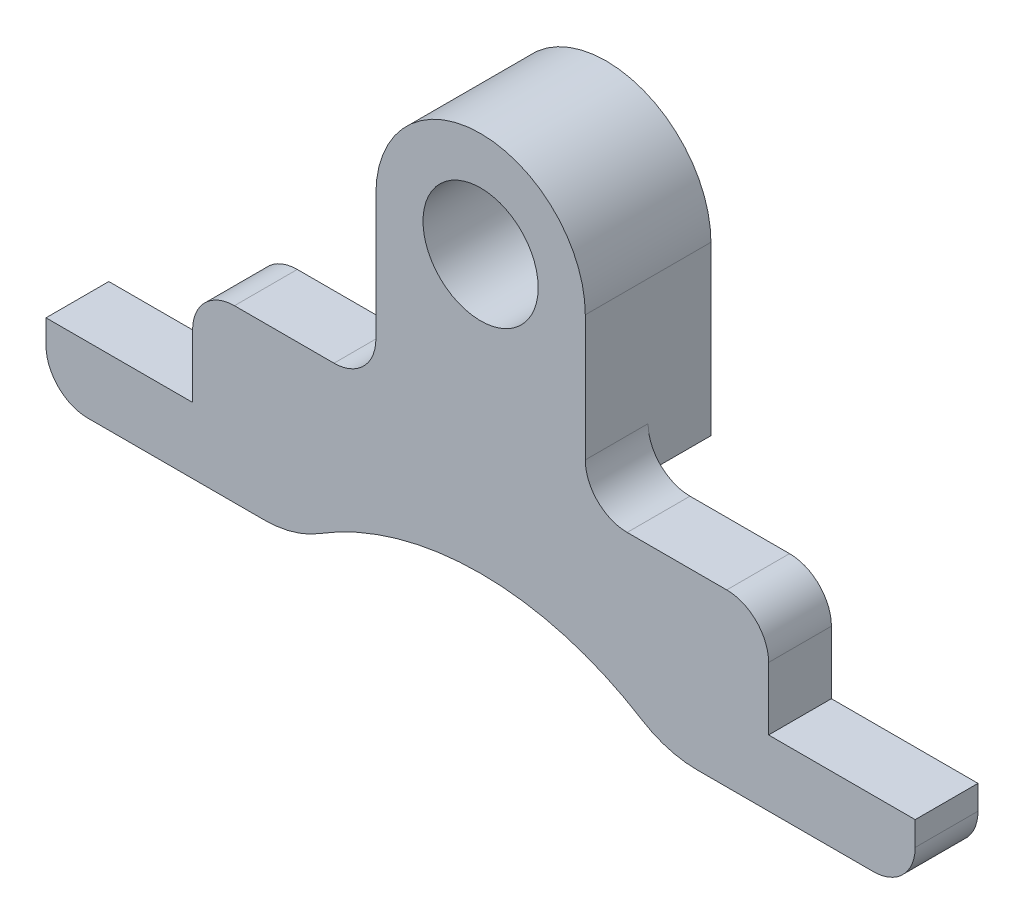
ISO-10303-21;
HEADER;
FILE_DESCRIPTION(('STEP AP214'),'2;1');
FILE_NAME('part.step','',(''),(''),'','','');
FILE_SCHEMA(('AUTOMOTIVE_DESIGN { 1 0 10303 214 1 1 1 1 }'));
ENDSEC;
DATA;
#1=APPLICATION_CONTEXT('core data for automotive mechanical design processes');
#2=APPLICATION_PROTOCOL_DEFINITION('international standard','automotive_design',2000,#1);
#3=PRODUCT_CONTEXT('',#1,'mechanical');
#4=PRODUCT('Part','Part','',(#3));
#5=PRODUCT_RELATED_PRODUCT_CATEGORY('part','',(#4));
#6=PRODUCT_DEFINITION_FORMATION('','',#4);
#7=PRODUCT_DEFINITION_CONTEXT('part definition',#1,'design');
#8=PRODUCT_DEFINITION('design','',#6,#7);
#9=PRODUCT_DEFINITION_SHAPE('','',#8);
#10=(LENGTH_UNIT() NAMED_UNIT(*) SI_UNIT(.MILLI.,.METRE.));
#11=(NAMED_UNIT(*) PLANE_ANGLE_UNIT() SI_UNIT($,.RADIAN.));
#12=(NAMED_UNIT(*) SI_UNIT($,.STERADIAN.) SOLID_ANGLE_UNIT());
#13=UNCERTAINTY_MEASURE_WITH_UNIT(LENGTH_MEASURE(1.E-05),#10,'distance_accuracy_value','');
#14=(GEOMETRIC_REPRESENTATION_CONTEXT(3) GLOBAL_UNCERTAINTY_ASSIGNED_CONTEXT((#13)) GLOBAL_UNIT_ASSIGNED_CONTEXT((#10,
#11,#12)) REPRESENTATION_CONTEXT('',''));
#15=CARTESIAN_POINT('',(0.,0.,0.));
#16=DIRECTION('',(0.,0.,1.));
#17=DIRECTION('',(1.,0.,0.));
#18=AXIS2_PLACEMENT_3D('',#15,#16,#17);
#19=CARTESIAN_POINT('',(0.,27.75,6.));
#20=DIRECTION('',(0.,0.,-1.));
#21=DIRECTION('',(-1.,0.,0.));
#22=AXIS2_PLACEMENT_3D('',#19,#20,#21);
#23=CYLINDRICAL_SURFACE('',#22,5.);
#24=CARTESIAN_POINT('',(0.,27.75,0.));
#25=DIRECTION('',(0.,0.,1.));
#26=DIRECTION('',(1.,0.,0.));
#27=AXIS2_PLACEMENT_3D('',#24,#25,#26);
#28=CIRCLE('',#27,5.);
#29=CARTESIAN_POINT('',(5.,27.75,0.));
#30=VERTEX_POINT('',#29);
#31=CARTESIAN_POINT('',(-5.,27.75,0.));
#32=VERTEX_POINT('',#31);
#33=EDGE_CURVE('E290',#30,#32,#28,.T.);
#34=ORIENTED_EDGE('',*,*,#33,.T.);
#35=DIRECTION('',(0.,0.,-1.));
#36=VECTOR('',#35,1.);
#37=CARTESIAN_POINT('',(-5.,27.75,6.));
#38=LINE('',#37,#36);
#39=CARTESIAN_POINT('',(-5.,27.75,6.));
#40=VERTEX_POINT('',#39);
#41=EDGE_CURVE('E306',#40,#32,#38,.T.);
#42=ORIENTED_EDGE('',*,*,#41,.F.);
#43=CARTESIAN_POINT('',(0.,27.75,6.));
#44=DIRECTION('',(0.,0.,1.));
#45=DIRECTION('',(1.,0.,0.));
#46=AXIS2_PLACEMENT_3D('',#43,#44,#45);
#47=CIRCLE('',#46,5.);
#48=CARTESIAN_POINT('',(5.,27.75,6.));
#49=VERTEX_POINT('',#48);
#50=EDGE_CURVE('E277',#49,#40,#47,.T.);
#51=ORIENTED_EDGE('',*,*,#50,.F.);
#52=DIRECTION('',(0.,0.,-1.));
#53=VECTOR('',#52,1.);
#54=CARTESIAN_POINT('',(5.,27.75,6.));
#55=LINE('',#54,#53);
#56=EDGE_CURVE('E287',#49,#30,#55,.T.);
#57=ORIENTED_EDGE('',*,*,#56,.T.);
#58=EDGE_LOOP('',(#34,#42,#51,#57));
#59=FACE_BOUND('',#58,.T.);
#60=ADVANCED_FACE('F35',(#59),#23,.T.);
#61=CARTESIAN_POINT('',(-5.,0.,6.));
#62=DIRECTION('',(1.,0.,0.));
#63=DIRECTION('',(0.,0.,-1.));
#64=AXIS2_PLACEMENT_3D('',#61,#62,#63);
#65=PLANE('',#64);
#66=DIRECTION('',(0.,0.,-1.));
#67=VECTOR('',#66,1.);
#68=CARTESIAN_POINT('',(-5.,19.75,6.));
#69=LINE('',#68,#67);
#70=CARTESIAN_POINT('',(-5.,19.75,3.));
#71=VERTEX_POINT('',#70);
#72=CARTESIAN_POINT('',(-5.,19.75,0.));
#73=VERTEX_POINT('',#72);
#74=EDGE_CURVE('E304',#71,#73,#69,.T.);
#75=ORIENTED_EDGE('',*,*,#74,.F.);
#76=DIRECTION('',(0.,1.,0.));
#77=VECTOR('',#76,1.);
#78=CARTESIAN_POINT('',(-5.,0.,3.));
#79=LINE('',#78,#77);
#80=CARTESIAN_POINT('',(-5.,21.75,3.));
#81=VERTEX_POINT('',#80);
#82=EDGE_CURVE('E326',#71,#81,#79,.T.);
#83=ORIENTED_EDGE('',*,*,#82,.T.);
#84=DIRECTION('',(0.,0.,-1.));
#85=VECTOR('',#84,1.);
#86=CARTESIAN_POINT('',(-5.,21.75,6.));
#87=LINE('',#86,#85);
#88=CARTESIAN_POINT('',(-5.,21.75,6.));
#89=VERTEX_POINT('',#88);
#90=EDGE_CURVE('E324',#81,#89,#87,.F.);
#91=ORIENTED_EDGE('',*,*,#90,.T.);
#92=DIRECTION('',(0.,-1.,0.));
#93=VECTOR('',#92,1.);
#94=CARTESIAN_POINT('',(-5.,0.,6.));
#95=LINE('',#94,#93);
#96=EDGE_CURVE('E281',#40,#89,#95,.T.);
#97=ORIENTED_EDGE('',*,*,#96,.F.);
#98=ORIENTED_EDGE('',*,*,#41,.T.);
#99=DIRECTION('',(0.,-1.,0.));
#100=VECTOR('',#99,1.);
#101=CARTESIAN_POINT('',(-5.,0.,0.));
#102=LINE('',#101,#100);
#103=EDGE_CURVE('E293',#32,#73,#102,.T.);
#104=ORIENTED_EDGE('',*,*,#103,.T.);
#105=EDGE_LOOP('',(#75,#83,#91,#97,#98,#104));
#106=FACE_BOUND('',#105,.T.);
#107=ADVANCED_FACE('F433',(#106),#65,.F.);
#108=CARTESIAN_POINT('',(0.,19.75,6.));
#109=DIRECTION('',(0.,1.,0.));
#110=DIRECTION('',(0.,0.,1.));
#111=AXIS2_PLACEMENT_3D('',#108,#109,#110);
#112=PLANE('',#111);
#113=DIRECTION('',(0.,0.,-1.));
#114=VECTOR('',#113,1.);
#115=CARTESIAN_POINT('',(5.,19.75,6.));
#116=LINE('',#115,#114);
#117=CARTESIAN_POINT('',(5.,19.75,3.));
#118=VERTEX_POINT('',#117);
#119=CARTESIAN_POINT('',(5.,19.75,0.));
#120=VERTEX_POINT('',#119);
#121=EDGE_CURVE('E302',#118,#120,#116,.T.);
#122=ORIENTED_EDGE('',*,*,#121,.F.);
#123=DIRECTION('',(-1.,0.,0.));
#124=VECTOR('',#123,1.);
#125=CARTESIAN_POINT('',(0.,19.75,3.));
#126=LINE('',#125,#124);
#127=EDGE_CURVE('E262',#118,#71,#126,.T.);
#128=ORIENTED_EDGE('',*,*,#127,.T.);
#129=ORIENTED_EDGE('',*,*,#74,.T.);
#130=DIRECTION('',(1.,0.,0.));
#131=VECTOR('',#130,1.);
#132=CARTESIAN_POINT('',(0.,19.75,0.));
#133=LINE('',#132,#131);
#134=EDGE_CURVE('E296',#73,#120,#133,.T.);
#135=ORIENTED_EDGE('',*,*,#134,.T.);
#136=EDGE_LOOP('',(#122,#128,#129,#135));
#137=FACE_BOUND('',#136,.T.);
#138=ADVANCED_FACE('F438',(#137),#112,.F.);
#139=CARTESIAN_POINT('',(0.,27.75,6.));
#140=DIRECTION('',(0.,0.,-1.));
#141=DIRECTION('',(-1.,0.,0.));
#142=AXIS2_PLACEMENT_3D('',#139,#140,#141);
#143=CYLINDRICAL_SURFACE('',#142,2.75);
#144=CARTESIAN_POINT('',(0.,27.75,6.));
#145=DIRECTION('',(0.,0.,1.));
#146=DIRECTION('',(1.,0.,0.));
#147=AXIS2_PLACEMENT_3D('',#144,#145,#146);
#148=CIRCLE('',#147,2.75);
#149=CARTESIAN_POINT('',(2.75,27.75,6.));
#150=VERTEX_POINT('',#149);
#151=EDGE_CURVE('E274',#150,#150,#148,.F.);
#152=ORIENTED_EDGE('',*,*,#151,.F.);
#153=EDGE_LOOP('',(#152));
#154=FACE_BOUND('',#153,.T.);
#155=CARTESIAN_POINT('',(0.,27.75,0.));
#156=DIRECTION('',(0.,0.,1.));
#157=DIRECTION('',(1.,0.,0.));
#158=AXIS2_PLACEMENT_3D('',#155,#156,#157);
#159=CIRCLE('',#158,2.75);
#160=CARTESIAN_POINT('',(2.75,27.75,0.));
#161=VERTEX_POINT('',#160);
#162=EDGE_CURVE('E209',#161,#161,#159,.F.);
#163=ORIENTED_EDGE('',*,*,#162,.T.);
#164=EDGE_LOOP('',(#163));
#165=FACE_BOUND('',#164,.T.);
#166=ADVANCED_FACE('F482',(#154,#165),#143,.F.);
#167=CARTESIAN_POINT('',(5.,0.,6.));
#168=DIRECTION('',(1.,0.,0.));
#169=DIRECTION('',(0.,0.,-1.));
#170=AXIS2_PLACEMENT_3D('',#167,#168,#169);
#171=PLANE('',#170);
#172=DIRECTION('',(0.,-1.,0.));
#173=VECTOR('',#172,1.);
#174=CARTESIAN_POINT('',(5.,0.,6.));
#175=LINE('',#174,#173);
#176=CARTESIAN_POINT('',(5.,21.75,6.));
#177=VERTEX_POINT('',#176);
#178=EDGE_CURVE('E284',#49,#177,#175,.T.);
#179=ORIENTED_EDGE('',*,*,#178,.T.);
#180=DIRECTION('',(0.,0.,-1.));
#181=VECTOR('',#180,1.);
#182=CARTESIAN_POINT('',(5.,21.75,6.));
#183=LINE('',#182,#181);
#184=CARTESIAN_POINT('',(5.,21.75,3.));
#185=VERTEX_POINT('',#184);
#186=EDGE_CURVE('E311',#177,#185,#183,.T.);
#187=ORIENTED_EDGE('',*,*,#186,.T.);
#188=DIRECTION('',(0.,-1.,0.));
#189=VECTOR('',#188,1.);
#190=CARTESIAN_POINT('',(5.,0.,3.));
#191=LINE('',#190,#189);
#192=EDGE_CURVE('E309',#185,#118,#191,.T.);
#193=ORIENTED_EDGE('',*,*,#192,.T.);
#194=ORIENTED_EDGE('',*,*,#121,.T.);
#195=DIRECTION('',(0.,-1.,0.));
#196=VECTOR('',#195,1.);
#197=CARTESIAN_POINT('',(5.,0.,0.));
#198=LINE('',#197,#196);
#199=EDGE_CURVE('E278',#30,#120,#198,.T.);
#200=ORIENTED_EDGE('',*,*,#199,.F.);
#201=ORIENTED_EDGE('',*,*,#56,.F.);
#202=EDGE_LOOP('',(#179,#187,#193,#194,#200,#201));
#203=FACE_BOUND('',#202,.T.);
#204=ADVANCED_FACE('F454',(#203),#171,.T.);
#205=CARTESIAN_POINT('',(0.,0.,6.));
#206=DIRECTION('',(0.,0.,1.));
#207=DIRECTION('',(1.,0.,0.));
#208=AXIS2_PLACEMENT_3D('',#205,#206,#207);
#209=PLANE('',#208);
#210=ORIENTED_EDGE('',*,*,#151,.T.);
#211=EDGE_LOOP('',(#210));
#212=FACE_BOUND('',#211,.T.);
#213=CARTESIAN_POINT('',(0.,0.,6.));
#214=DIRECTION('',(0.,0.,1.));
#215=DIRECTION('',(1.,0.,0.));
#216=AXIS2_PLACEMENT_3D('',#213,#214,#215);
#217=CIRCLE('',#216,14.5563250606717);
#218=CARTESIAN_POINT('',(-7.69690736423247,12.3549268026307,6.));
#219=VERTEX_POINT('',#218);
#220=CARTESIAN_POINT('',(7.69690736423247,12.3549268026307,6.));
#221=VERTEX_POINT('',#220);
#222=EDGE_CURVE('E228',#219,#221,#217,.F.);
#223=ORIENTED_EDGE('',*,*,#222,.T.);
#224=CARTESIAN_POINT('',(10.3407434053181,16.5987612701679,6.));
#225=DIRECTION('',(0.,0.,1.));
#226=DIRECTION('',(1.,0.,0.));
#227=AXIS2_PLACEMENT_3D('',#224,#225,#226);
#228=CIRCLE('',#227,5.);
#229=CARTESIAN_POINT('',(10.3407434053181,11.5987612701679,6.));
#230=VERTEX_POINT('',#229);
#231=EDGE_CURVE('E43',#221,#230,#228,.T.);
#232=ORIENTED_EDGE('',*,*,#231,.T.);
#233=DIRECTION('',(-1.,0.,0.));
#234=VECTOR('',#233,1.);
#235=CARTESIAN_POINT('',(0.,11.5987612701679,6.));
#236=LINE('',#235,#234);
#237=CARTESIAN_POINT('',(18.753194099318,11.5987612701679,6.));
#238=VERTEX_POINT('',#237);
#239=EDGE_CURVE('E225',#238,#230,#236,.T.);
#240=ORIENTED_EDGE('',*,*,#239,.F.);
#241=CARTESIAN_POINT('',(18.753194099318,13.5987612701679,6.));
#242=DIRECTION('',(0.,0.,1.));
#243=DIRECTION('',(1.,0.,0.));
#244=AXIS2_PLACEMENT_3D('',#241,#242,#243);
#245=CIRCLE('',#244,2.);
#246=CARTESIAN_POINT('',(20.753194099318,13.5987612701679,6.));
#247=VERTEX_POINT('',#246);
#248=EDGE_CURVE('E224',#238,#247,#245,.T.);
#249=ORIENTED_EDGE('',*,*,#248,.T.);
#250=DIRECTION('',(0.,-1.,0.));
#251=VECTOR('',#250,1.);
#252=CARTESIAN_POINT('',(20.753194099318,0.,6.));
#253=LINE('',#252,#251);
#254=CARTESIAN_POINT('',(20.753194099318,14.75,6.));
#255=VERTEX_POINT('',#254);
#256=EDGE_CURVE('E203',#255,#247,#253,.T.);
#257=ORIENTED_EDGE('',*,*,#256,.F.);
#258=DIRECTION('',(-1.,0.,0.));
#259=VECTOR('',#258,1.);
#260=CARTESIAN_POINT('',(0.,14.75,6.));
#261=LINE('',#260,#259);
#262=CARTESIAN_POINT('',(13.753194099318,14.75,6.));
#263=VERTEX_POINT('',#262);
#264=EDGE_CURVE('E213',#255,#263,#261,.T.);
#265=ORIENTED_EDGE('',*,*,#264,.T.);
#266=DIRECTION('',(0.,1.,0.));
#267=VECTOR('',#266,1.);
#268=CARTESIAN_POINT('',(13.753194099318,0.,6.));
#269=LINE('',#268,#267);
#270=CARTESIAN_POINT('',(13.753194099318,17.75,6.));
#271=VERTEX_POINT('',#270);
#272=EDGE_CURVE('E219',#263,#271,#269,.T.);
#273=ORIENTED_EDGE('',*,*,#272,.T.);
#274=CARTESIAN_POINT('',(11.753194099318,17.75,6.));
#275=DIRECTION('',(0.,0.,1.));
#276=DIRECTION('',(1.,0.,0.));
#277=AXIS2_PLACEMENT_3D('',#274,#275,#276);
#278=CIRCLE('',#277,2.);
#279=CARTESIAN_POINT('',(11.753194099318,19.75,6.));
#280=VERTEX_POINT('',#279);
#281=EDGE_CURVE('E344',#271,#280,#278,.T.);
#282=ORIENTED_EDGE('',*,*,#281,.T.);
#283=DIRECTION('',(-1.,0.,0.));
#284=VECTOR('',#283,1.);
#285=CARTESIAN_POINT('',(0.,19.75,6.));
#286=LINE('',#285,#284);
#287=CARTESIAN_POINT('',(7.,19.75,6.));
#288=VERTEX_POINT('',#287);
#289=EDGE_CURVE('E236',#280,#288,#286,.T.);
#290=ORIENTED_EDGE('',*,*,#289,.T.);
#291=CARTESIAN_POINT('',(7.,21.75,6.));
#292=DIRECTION('',(0.,0.,1.));
#293=DIRECTION('',(1.,0.,0.));
#294=AXIS2_PLACEMENT_3D('',#291,#292,#293);
#295=CIRCLE('',#294,2.);
#296=EDGE_CURVE('E360',#288,#177,#295,.F.);
#297=ORIENTED_EDGE('',*,*,#296,.T.);
#298=ORIENTED_EDGE('',*,*,#178,.F.);
#299=ORIENTED_EDGE('',*,*,#50,.T.);
#300=ORIENTED_EDGE('',*,*,#96,.T.);
#301=CARTESIAN_POINT('',(-7.,21.75,6.));
#302=DIRECTION('',(0.,0.,1.));
#303=DIRECTION('',(1.,0.,0.));
#304=AXIS2_PLACEMENT_3D('',#301,#302,#303);
#305=CIRCLE('',#304,2.);
#306=CARTESIAN_POINT('',(-7.,19.75,6.));
#307=VERTEX_POINT('',#306);
#308=EDGE_CURVE('E364',#89,#307,#305,.F.);
#309=ORIENTED_EDGE('',*,*,#308,.T.);
#310=CARTESIAN_POINT('',(-11.753194099318,19.75,6.));
#311=VERTEX_POINT('',#310);
#312=EDGE_CURVE('E233',#307,#311,#286,.T.);
#313=ORIENTED_EDGE('',*,*,#312,.T.);
#314=CARTESIAN_POINT('',(-11.753194099318,17.75,6.));
#315=DIRECTION('',(0.,0.,1.));
#316=DIRECTION('',(1.,0.,0.));
#317=AXIS2_PLACEMENT_3D('',#314,#315,#316);
#318=CIRCLE('',#317,2.);
#319=CARTESIAN_POINT('',(-13.753194099318,17.75,6.));
#320=VERTEX_POINT('',#319);
#321=EDGE_CURVE('E342',#311,#320,#318,.T.);
#322=ORIENTED_EDGE('',*,*,#321,.T.);
#323=DIRECTION('',(0.,-1.,0.));
#324=VECTOR('',#323,1.);
#325=CARTESIAN_POINT('',(-13.753194099318,0.,6.));
#326=LINE('',#325,#324);
#327=CARTESIAN_POINT('',(-13.753194099318,14.75,6.));
#328=VERTEX_POINT('',#327);
#329=EDGE_CURVE('E237',#320,#328,#326,.T.);
#330=ORIENTED_EDGE('',*,*,#329,.T.);
#331=DIRECTION('',(-1.,0.,0.));
#332=VECTOR('',#331,1.);
#333=CARTESIAN_POINT('',(0.,14.75,6.));
#334=LINE('',#333,#332);
#335=CARTESIAN_POINT('',(-20.753194099318,14.75,6.));
#336=VERTEX_POINT('',#335);
#337=EDGE_CURVE('E239',#328,#336,#334,.T.);
#338=ORIENTED_EDGE('',*,*,#337,.T.);
#339=DIRECTION('',(0.,-1.,0.));
#340=VECTOR('',#339,1.);
#341=CARTESIAN_POINT('',(-20.753194099318,0.,6.));
#342=LINE('',#341,#340);
#343=CARTESIAN_POINT('',(-20.753194099318,13.5987612701679,6.));
#344=VERTEX_POINT('',#343);
#345=EDGE_CURVE('E267',#336,#344,#342,.T.);
#346=ORIENTED_EDGE('',*,*,#345,.T.);
#347=CARTESIAN_POINT('',(-18.753194099318,13.5987612701679,6.));
#348=DIRECTION('',(0.,0.,1.));
#349=DIRECTION('',(1.,0.,0.));
#350=AXIS2_PLACEMENT_3D('',#347,#348,#349);
#351=CIRCLE('',#350,2.);
#352=CARTESIAN_POINT('',(-18.753194099318,11.5987612701679,6.));
#353=VERTEX_POINT('',#352);
#354=EDGE_CURVE('E339',#344,#353,#351,.T.);
#355=ORIENTED_EDGE('',*,*,#354,.T.);
#356=DIRECTION('',(1.,0.,0.));
#357=VECTOR('',#356,1.);
#358=CARTESIAN_POINT('',(0.,11.5987612701679,6.));
#359=LINE('',#358,#357);
#360=CARTESIAN_POINT('',(-10.3407434053181,11.5987612701679,6.));
#361=VERTEX_POINT('',#360);
#362=EDGE_CURVE('E396',#353,#361,#359,.T.);
#363=ORIENTED_EDGE('',*,*,#362,.T.);
#364=CARTESIAN_POINT('',(-10.3407434053181,16.5987612701679,6.));
#365=DIRECTION('',(0.,0.,1.));
#366=DIRECTION('',(1.,0.,0.));
#367=AXIS2_PLACEMENT_3D('',#364,#365,#366);
#368=CIRCLE('',#367,5.);
#369=EDGE_CURVE('E377',#361,#219,#368,.T.);
#370=ORIENTED_EDGE('',*,*,#369,.T.);
#371=EDGE_LOOP('',(#223,#232,#240,#249,#257,#265,#273,#282,#290,#297,#298,#299,#300,#309,#313,
#322,#330,#338,#346,#355,#363,#370));
#372=FACE_BOUND('',#371,.T.);
#373=ADVANCED_FACE('F221',(#212,#372),#209,.T.);
#374=CARTESIAN_POINT('',(0.,0.,0.));
#375=DIRECTION('',(0.,0.,1.));
#376=DIRECTION('',(1.,0.,0.));
#377=AXIS2_PLACEMENT_3D('',#374,#375,#376);
#378=PLANE('',#377);
#379=ORIENTED_EDGE('',*,*,#162,.F.);
#380=EDGE_LOOP('',(#379));
#381=FACE_BOUND('',#380,.T.);
#382=ORIENTED_EDGE('',*,*,#33,.F.);
#383=ORIENTED_EDGE('',*,*,#199,.T.);
#384=ORIENTED_EDGE('',*,*,#134,.F.);
#385=ORIENTED_EDGE('',*,*,#103,.F.);
#386=EDGE_LOOP('',(#382,#383,#384,#385));
#387=FACE_BOUND('',#386,.T.);
#388=ADVANCED_FACE('F461',(#381,#387),#378,.F.);
#389=CARTESIAN_POINT('',(0.,19.75,6.));
#390=DIRECTION('',(0.,-1.,0.));
#391=DIRECTION('',(0.,0.,-1.));
#392=AXIS2_PLACEMENT_3D('',#389,#390,#391);
#393=PLANE('',#392);
#394=ORIENTED_EDGE('',*,*,#312,.F.);
#395=DIRECTION('',(0.,0.,-1.));
#396=VECTOR('',#395,1.);
#397=CARTESIAN_POINT('',(-7.,19.75,3.));
#398=LINE('',#397,#396);
#399=CARTESIAN_POINT('',(-7.,19.75,3.));
#400=VERTEX_POINT('',#399);
#401=EDGE_CURVE('E321',#307,#400,#398,.T.);
#402=ORIENTED_EDGE('',*,*,#401,.T.);
#403=CARTESIAN_POINT('',(-11.753194099318,19.75,3.));
#404=VERTEX_POINT('',#403);
#405=EDGE_CURVE('E258',#400,#404,#126,.T.);
#406=ORIENTED_EDGE('',*,*,#405,.T.);
#407=DIRECTION('',(0.,0.,-1.));
#408=VECTOR('',#407,1.);
#409=CARTESIAN_POINT('',(-11.753194099318,19.75,6.));
#410=LINE('',#409,#408);
#411=EDGE_CURVE('E319',#404,#311,#410,.F.);
#412=ORIENTED_EDGE('',*,*,#411,.T.);
#413=EDGE_LOOP('',(#394,#402,#406,#412));
#414=FACE_BOUND('',#413,.T.);
#415=ADVANCED_FACE('F424',(#414),#393,.F.);
#416=CARTESIAN_POINT('',(-20.753194099318,0.,6.));
#417=DIRECTION('',(1.,0.,0.));
#418=DIRECTION('',(0.,0.,-1.));
#419=AXIS2_PLACEMENT_3D('',#416,#417,#418);
#420=PLANE('',#419);
#421=DIRECTION('',(0.,-1.,0.));
#422=VECTOR('',#421,1.);
#423=CARTESIAN_POINT('',(-20.753194099318,0.,3.));
#424=LINE('',#423,#422);
#425=CARTESIAN_POINT('',(-20.753194099318,14.75,3.));
#426=VERTEX_POINT('',#425);
#427=CARTESIAN_POINT('',(-20.753194099318,13.5987612701679,3.));
#428=VERTEX_POINT('',#427);
#429=EDGE_CURVE('E242',#426,#428,#424,.T.);
#430=ORIENTED_EDGE('',*,*,#429,.T.);
#431=DIRECTION('',(0.,0.,-1.));
#432=VECTOR('',#431,1.);
#433=CARTESIAN_POINT('',(-20.753194099318,13.5987612701679,6.));
#434=LINE('',#433,#432);
#435=EDGE_CURVE('E356',#428,#344,#434,.F.);
#436=ORIENTED_EDGE('',*,*,#435,.T.);
#437=ORIENTED_EDGE('',*,*,#345,.F.);
#438=DIRECTION('',(0.,0.,-1.));
#439=VECTOR('',#438,1.);
#440=CARTESIAN_POINT('',(-20.753194099318,14.75,6.));
#441=LINE('',#440,#439);
#442=EDGE_CURVE('E241',#336,#426,#441,.T.);
#443=ORIENTED_EDGE('',*,*,#442,.T.);
#444=EDGE_LOOP('',(#430,#436,#437,#443));
#445=FACE_BOUND('',#444,.T.);
#446=ADVANCED_FACE('F404',(#445),#420,.F.);
#447=CARTESIAN_POINT('',(0.,11.5987612701679,6.));
#448=DIRECTION('',(0.,1.,0.));
#449=DIRECTION('',(0.,0.,1.));
#450=AXIS2_PLACEMENT_3D('',#447,#448,#449);
#451=PLANE('',#450);
#452=DIRECTION('',(1.,0.,0.));
#453=VECTOR('',#452,1.);
#454=CARTESIAN_POINT('',(0.,11.5987612701679,3.));
#455=LINE('',#454,#453);
#456=CARTESIAN_POINT('',(-18.753194099318,11.5987612701679,3.));
#457=VERTEX_POINT('',#456);
#458=CARTESIAN_POINT('',(-10.3407434053181,11.5987612701679,3.));
#459=VERTEX_POINT('',#458);
#460=EDGE_CURVE('E245',#457,#459,#455,.T.);
#461=ORIENTED_EDGE('',*,*,#460,.T.);
#462=DIRECTION('',(0.,0.,-1.));
#463=VECTOR('',#462,1.);
#464=CARTESIAN_POINT('',(-10.3407434053181,11.5987612701679,6.));
#465=LINE('',#464,#463);
#466=EDGE_CURVE('E11',#459,#361,#465,.F.);
#467=ORIENTED_EDGE('',*,*,#466,.T.);
#468=ORIENTED_EDGE('',*,*,#362,.F.);
#469=DIRECTION('',(0.,0.,-1.));
#470=VECTOR('',#469,1.);
#471=CARTESIAN_POINT('',(-18.753194099318,11.5987612701679,6.));
#472=LINE('',#471,#470);
#473=EDGE_CURVE('E353',#353,#457,#472,.T.);
#474=ORIENTED_EDGE('',*,*,#473,.T.);
#475=EDGE_LOOP('',(#461,#467,#468,#474));
#476=FACE_BOUND('',#475,.T.);
#477=ADVANCED_FACE('F394',(#476),#451,.F.);
#478=CARTESIAN_POINT('',(0.,0.,6.));
#479=DIRECTION('',(0.,0.,-1.));
#480=DIRECTION('',(-1.,0.,0.));
#481=AXIS2_PLACEMENT_3D('',#478,#479,#480);
#482=CYLINDRICAL_SURFACE('',#481,14.5563250606717);
#483=CARTESIAN_POINT('',(0.,0.,3.));
#484=DIRECTION('',(0.,0.,1.));
#485=DIRECTION('',(1.,0.,0.));
#486=AXIS2_PLACEMENT_3D('',#483,#484,#485);
#487=CIRCLE('',#486,14.5563250606717);
#488=CARTESIAN_POINT('',(-7.69690736423247,12.3549268026307,3.));
#489=VERTEX_POINT('',#488);
#490=CARTESIAN_POINT('',(7.69690736423247,12.3549268026307,3.));
#491=VERTEX_POINT('',#490);
#492=EDGE_CURVE('E247',#489,#491,#487,.F.);
#493=ORIENTED_EDGE('',*,*,#492,.T.);
#494=DIRECTION('',(0.,0.,-1.));
#495=VECTOR('',#494,1.);
#496=CARTESIAN_POINT('',(7.69690736423248,12.3549268026307,6.));
#497=LINE('',#496,#495);
#498=EDGE_CURVE('E56',#491,#221,#497,.F.);
#499=ORIENTED_EDGE('',*,*,#498,.T.);
#500=ORIENTED_EDGE('',*,*,#222,.F.);
#501=DIRECTION('',(0.,0.,-1.));
#502=VECTOR('',#501,1.);
#503=CARTESIAN_POINT('',(-7.69690736423248,12.3549268026307,6.));
#504=LINE('',#503,#502);
#505=EDGE_CURVE('E373',#219,#489,#504,.T.);
#506=ORIENTED_EDGE('',*,*,#505,.T.);
#507=EDGE_LOOP('',(#493,#499,#500,#506));
#508=FACE_BOUND('',#507,.T.);
#509=ADVANCED_FACE('F389',(#508),#482,.F.);
#510=CARTESIAN_POINT('',(0.,11.5987612701679,6.));
#511=DIRECTION('',(0.,-1.,0.));
#512=DIRECTION('',(0.,0.,-1.));
#513=AXIS2_PLACEMENT_3D('',#510,#511,#512);
#514=PLANE('',#513);
#515=ORIENTED_EDGE('',*,*,#239,.T.);
#516=DIRECTION('',(0.,0.,1.));
#517=VECTOR('',#516,1.);
#518=CARTESIAN_POINT('',(10.3407434053181,11.5987612701679,3.));
#519=LINE('',#518,#517);
#520=CARTESIAN_POINT('',(10.3407434053181,11.5987612701679,3.));
#521=VERTEX_POINT('',#520);
#522=EDGE_CURVE('E366',#230,#521,#519,.F.);
#523=ORIENTED_EDGE('',*,*,#522,.T.);
#524=DIRECTION('',(-1.,0.,0.));
#525=VECTOR('',#524,1.);
#526=CARTESIAN_POINT('',(0.,11.5987612701679,3.));
#527=LINE('',#526,#525);
#528=CARTESIAN_POINT('',(18.753194099318,11.5987612701679,3.));
#529=VERTEX_POINT('',#528);
#530=EDGE_CURVE('E249',#529,#521,#527,.T.);
#531=ORIENTED_EDGE('',*,*,#530,.F.);
#532=DIRECTION('',(0.,0.,-1.));
#533=VECTOR('',#532,1.);
#534=CARTESIAN_POINT('',(18.753194099318,11.5987612701679,6.));
#535=LINE('',#534,#533);
#536=EDGE_CURVE('E351',#529,#238,#535,.F.);
#537=ORIENTED_EDGE('',*,*,#536,.T.);
#538=EDGE_LOOP('',(#515,#523,#531,#537));
#539=FACE_BOUND('',#538,.T.);
#540=ADVANCED_FACE('F382',(#539),#514,.T.);
#541=CARTESIAN_POINT('',(20.753194099318,0.,6.));
#542=DIRECTION('',(1.,0.,0.));
#543=DIRECTION('',(0.,0.,-1.));
#544=AXIS2_PLACEMENT_3D('',#541,#542,#543);
#545=PLANE('',#544);
#546=ORIENTED_EDGE('',*,*,#256,.T.);
#547=DIRECTION('',(0.,0.,-1.));
#548=VECTOR('',#547,1.);
#549=CARTESIAN_POINT('',(20.753194099318,13.5987612701679,6.));
#550=LINE('',#549,#548);
#551=CARTESIAN_POINT('',(20.753194099318,13.5987612701679,3.));
#552=VERTEX_POINT('',#551);
#553=EDGE_CURVE('E349',#247,#552,#550,.T.);
#554=ORIENTED_EDGE('',*,*,#553,.T.);
#555=DIRECTION('',(0.,-1.,0.));
#556=VECTOR('',#555,1.);
#557=CARTESIAN_POINT('',(20.753194099318,0.,3.));
#558=LINE('',#557,#556);
#559=CARTESIAN_POINT('',(20.753194099318,14.75,3.));
#560=VERTEX_POINT('',#559);
#561=EDGE_CURVE('E206',#560,#552,#558,.T.);
#562=ORIENTED_EDGE('',*,*,#561,.F.);
#563=DIRECTION('',(0.,0.,-1.));
#564=VECTOR('',#563,1.);
#565=CARTESIAN_POINT('',(20.753194099318,14.75,6.));
#566=LINE('',#565,#564);
#567=EDGE_CURVE('E198',#255,#560,#566,.T.);
#568=ORIENTED_EDGE('',*,*,#567,.F.);
#569=EDGE_LOOP('',(#546,#554,#562,#568));
#570=FACE_BOUND('',#569,.T.);
#571=ADVANCED_FACE('F200',(#570),#545,.T.);
#572=CARTESIAN_POINT('',(0.,14.75,6.));
#573=DIRECTION('',(0.,-1.,0.));
#574=DIRECTION('',(0.,0.,-1.));
#575=AXIS2_PLACEMENT_3D('',#572,#573,#574);
#576=PLANE('',#575);
#577=DIRECTION('',(-1.,0.,0.));
#578=VECTOR('',#577,1.);
#579=CARTESIAN_POINT('',(0.,14.75,3.));
#580=LINE('',#579,#578);
#581=CARTESIAN_POINT('',(13.753194099318,14.75,3.));
#582=VERTEX_POINT('',#581);
#583=EDGE_CURVE('E253',#560,#582,#580,.T.);
#584=ORIENTED_EDGE('',*,*,#583,.T.);
#585=DIRECTION('',(0.,0.,-1.));
#586=VECTOR('',#585,1.);
#587=CARTESIAN_POINT('',(13.753194099318,14.75,6.));
#588=LINE('',#587,#586);
#589=EDGE_CURVE('E210',#263,#582,#588,.T.);
#590=ORIENTED_EDGE('',*,*,#589,.F.);
#591=ORIENTED_EDGE('',*,*,#264,.F.);
#592=ORIENTED_EDGE('',*,*,#567,.T.);
#593=EDGE_LOOP('',(#584,#590,#591,#592));
#594=FACE_BOUND('',#593,.T.);
#595=ADVANCED_FACE('F214',(#594),#576,.F.);
#596=CARTESIAN_POINT('',(13.753194099318,0.,6.));
#597=DIRECTION('',(-1.,0.,0.));
#598=DIRECTION('',(0.,0.,1.));
#599=AXIS2_PLACEMENT_3D('',#596,#597,#598);
#600=PLANE('',#599);
#601=DIRECTION('',(0.,1.,0.));
#602=VECTOR('',#601,1.);
#603=CARTESIAN_POINT('',(13.753194099318,0.,3.));
#604=LINE('',#603,#602);
#605=CARTESIAN_POINT('',(13.753194099318,17.75,3.));
#606=VERTEX_POINT('',#605);
#607=EDGE_CURVE('E255',#582,#606,#604,.T.);
#608=ORIENTED_EDGE('',*,*,#607,.T.);
#609=DIRECTION('',(0.,0.,-1.));
#610=VECTOR('',#609,1.);
#611=CARTESIAN_POINT('',(13.753194099318,17.75,6.));
#612=LINE('',#611,#610);
#613=EDGE_CURVE('E337',#606,#271,#612,.F.);
#614=ORIENTED_EDGE('',*,*,#613,.T.);
#615=ORIENTED_EDGE('',*,*,#272,.F.);
#616=ORIENTED_EDGE('',*,*,#589,.T.);
#617=EDGE_LOOP('',(#608,#614,#615,#616));
#618=FACE_BOUND('',#617,.T.);
#619=ADVANCED_FACE('F614',(#618),#600,.F.);
#620=CARTESIAN_POINT('',(11.753194099318,19.75,3.));
#621=VERTEX_POINT('',#620);
#622=CARTESIAN_POINT('',(7.,19.75,3.));
#623=VERTEX_POINT('',#622);
#624=EDGE_CURVE('E261',#621,#623,#126,.T.);
#625=ORIENTED_EDGE('',*,*,#624,.T.);
#626=DIRECTION('',(0.,0.,-1.));
#627=VECTOR('',#626,1.);
#628=CARTESIAN_POINT('',(7.,19.75,6.));
#629=LINE('',#628,#627);
#630=EDGE_CURVE('E317',#623,#288,#629,.F.);
#631=ORIENTED_EDGE('',*,*,#630,.T.);
#632=ORIENTED_EDGE('',*,*,#289,.F.);
#633=DIRECTION('',(0.,0.,-1.));
#634=VECTOR('',#633,1.);
#635=CARTESIAN_POINT('',(11.753194099318,19.75,6.));
#636=LINE('',#635,#634);
#637=EDGE_CURVE('E314',#280,#621,#636,.T.);
#638=ORIENTED_EDGE('',*,*,#637,.T.);
#639=EDGE_LOOP('',(#625,#631,#632,#638));
#640=FACE_BOUND('',#639,.T.);
#641=ADVANCED_FACE('F444',(#640),#393,.F.);
#642=CARTESIAN_POINT('',(-13.753194099318,0.,6.));
#643=DIRECTION('',(1.,0.,0.));
#644=DIRECTION('',(0.,0.,-1.));
#645=AXIS2_PLACEMENT_3D('',#642,#643,#644);
#646=PLANE('',#645);
#647=ORIENTED_EDGE('',*,*,#329,.F.);
#648=DIRECTION('',(0.,0.,-1.));
#649=VECTOR('',#648,1.);
#650=CARTESIAN_POINT('',(-13.753194099318,17.75,6.));
#651=LINE('',#650,#649);
#652=CARTESIAN_POINT('',(-13.753194099318,17.75,3.));
#653=VERTEX_POINT('',#652);
#654=EDGE_CURVE('E346',#320,#653,#651,.T.);
#655=ORIENTED_EDGE('',*,*,#654,.T.);
#656=DIRECTION('',(0.,-1.,0.));
#657=VECTOR('',#656,1.);
#658=CARTESIAN_POINT('',(-13.753194099318,0.,3.));
#659=LINE('',#658,#657);
#660=CARTESIAN_POINT('',(-13.753194099318,14.75,3.));
#661=VERTEX_POINT('',#660);
#662=EDGE_CURVE('E263',#653,#661,#659,.T.);
#663=ORIENTED_EDGE('',*,*,#662,.T.);
#664=DIRECTION('',(0.,0.,-1.));
#665=VECTOR('',#664,1.);
#666=CARTESIAN_POINT('',(-13.753194099318,14.75,6.));
#667=LINE('',#666,#665);
#668=EDGE_CURVE('E270',#328,#661,#667,.T.);
#669=ORIENTED_EDGE('',*,*,#668,.F.);
#670=EDGE_LOOP('',(#647,#655,#663,#669));
#671=FACE_BOUND('',#670,.T.);
#672=ADVANCED_FACE('F416',(#671),#646,.F.);
#673=CARTESIAN_POINT('',(0.,14.75,6.));
#674=DIRECTION('',(0.,-1.,0.));
#675=DIRECTION('',(0.,0.,-1.));
#676=AXIS2_PLACEMENT_3D('',#673,#674,#675);
#677=PLANE('',#676);
#678=DIRECTION('',(-1.,0.,0.));
#679=VECTOR('',#678,1.);
#680=CARTESIAN_POINT('',(0.,14.75,3.));
#681=LINE('',#680,#679);
#682=EDGE_CURVE('E265',#661,#426,#681,.T.);
#683=ORIENTED_EDGE('',*,*,#682,.T.);
#684=ORIENTED_EDGE('',*,*,#442,.F.);
#685=ORIENTED_EDGE('',*,*,#337,.F.);
#686=ORIENTED_EDGE('',*,*,#668,.T.);
#687=EDGE_LOOP('',(#683,#684,#685,#686));
#688=FACE_BOUND('',#687,.T.);
#689=ADVANCED_FACE('F410',(#688),#677,.F.);
#690=CARTESIAN_POINT('',(0.,0.,3.));
#691=DIRECTION('',(0.,0.,1.));
#692=DIRECTION('',(1.,0.,0.));
#693=AXIS2_PLACEMENT_3D('',#690,#691,#692);
#694=PLANE('',#693);
#695=ORIENTED_EDGE('',*,*,#530,.T.);
#696=CARTESIAN_POINT('',(10.3407434053181,16.5987612701679,3.));
#697=DIRECTION('',(0.,0.,1.));
#698=DIRECTION('',(1.,0.,0.));
#699=AXIS2_PLACEMENT_3D('',#696,#697,#698);
#700=CIRCLE('',#699,5.);
#701=EDGE_CURVE('E371',#521,#491,#700,.F.);
#702=ORIENTED_EDGE('',*,*,#701,.T.);
#703=ORIENTED_EDGE('',*,*,#492,.F.);
#704=CARTESIAN_POINT('',(-10.3407434053181,16.5987612701679,3.));
#705=DIRECTION('',(0.,0.,1.));
#706=DIRECTION('',(1.,0.,0.));
#707=AXIS2_PLACEMENT_3D('',#704,#705,#706);
#708=CIRCLE('',#707,5.);
#709=EDGE_CURVE('E369',#489,#459,#708,.F.);
#710=ORIENTED_EDGE('',*,*,#709,.T.);
#711=ORIENTED_EDGE('',*,*,#460,.F.);
#712=CARTESIAN_POINT('',(-18.753194099318,13.5987612701679,3.));
#713=DIRECTION('',(0.,0.,1.));
#714=DIRECTION('',(1.,0.,0.));
#715=AXIS2_PLACEMENT_3D('',#712,#713,#714);
#716=CIRCLE('',#715,2.);
#717=EDGE_CURVE('E329',#457,#428,#716,.F.);
#718=ORIENTED_EDGE('',*,*,#717,.T.);
#719=ORIENTED_EDGE('',*,*,#429,.F.);
#720=ORIENTED_EDGE('',*,*,#682,.F.);
#721=ORIENTED_EDGE('',*,*,#662,.F.);
#722=CARTESIAN_POINT('',(-11.753194099318,17.75,3.));
#723=DIRECTION('',(0.,0.,1.));
#724=DIRECTION('',(1.,0.,0.));
#725=AXIS2_PLACEMENT_3D('',#722,#723,#724);
#726=CIRCLE('',#725,2.);
#727=EDGE_CURVE('E333',#653,#404,#726,.F.);
#728=ORIENTED_EDGE('',*,*,#727,.T.);
#729=ORIENTED_EDGE('',*,*,#405,.F.);
#730=CARTESIAN_POINT('',(-7.,21.75,3.));
#731=DIRECTION('',(0.,0.,1.));
#732=DIRECTION('',(1.,0.,0.));
#733=AXIS2_PLACEMENT_3D('',#730,#731,#732);
#734=CIRCLE('',#733,2.);
#735=EDGE_CURVE('E362',#400,#81,#734,.T.);
#736=ORIENTED_EDGE('',*,*,#735,.T.);
#737=ORIENTED_EDGE('',*,*,#82,.F.);
#738=ORIENTED_EDGE('',*,*,#127,.F.);
#739=ORIENTED_EDGE('',*,*,#192,.F.);
#740=CARTESIAN_POINT('',(7.,21.75,3.));
#741=DIRECTION('',(0.,0.,1.));
#742=DIRECTION('',(1.,0.,0.));
#743=AXIS2_PLACEMENT_3D('',#740,#741,#742);
#744=CIRCLE('',#743,2.);
#745=EDGE_CURVE('E358',#185,#623,#744,.T.);
#746=ORIENTED_EDGE('',*,*,#745,.T.);
#747=ORIENTED_EDGE('',*,*,#624,.F.);
#748=CARTESIAN_POINT('',(11.753194099318,17.75,3.));
#749=DIRECTION('',(0.,0.,1.));
#750=DIRECTION('',(1.,0.,0.));
#751=AXIS2_PLACEMENT_3D('',#748,#749,#750);
#752=CIRCLE('',#751,2.);
#753=EDGE_CURVE('E335',#621,#606,#752,.F.);
#754=ORIENTED_EDGE('',*,*,#753,.T.);
#755=ORIENTED_EDGE('',*,*,#607,.F.);
#756=ORIENTED_EDGE('',*,*,#583,.F.);
#757=ORIENTED_EDGE('',*,*,#561,.T.);
#758=CARTESIAN_POINT('',(18.753194099318,13.5987612701679,3.));
#759=DIRECTION('',(0.,0.,1.));
#760=DIRECTION('',(1.,0.,0.));
#761=AXIS2_PLACEMENT_3D('',#758,#759,#760);
#762=CIRCLE('',#761,2.);
#763=EDGE_CURVE('E331',#552,#529,#762,.F.);
#764=ORIENTED_EDGE('',*,*,#763,.T.);
#765=EDGE_LOOP('',(#695,#702,#703,#710,#711,#718,#719,#720,#721,#728,#729,#736,#737,#738,#739,
#746,#747,#754,#755,#756,#757,#764));
#766=FACE_BOUND('',#765,.T.);
#767=ADVANCED_FACE('F388',(#766),#694,.F.);
#768=CARTESIAN_POINT('',(7.,21.75,6.));
#769=DIRECTION('',(0.,0.,-1.));
#770=DIRECTION('',(-1.,0.,0.));
#771=AXIS2_PLACEMENT_3D('',#768,#769,#770);
#772=CYLINDRICAL_SURFACE('',#771,2.);
#773=ORIENTED_EDGE('',*,*,#296,.F.);
#774=ORIENTED_EDGE('',*,*,#630,.F.);
#775=ORIENTED_EDGE('',*,*,#745,.F.);
#776=ORIENTED_EDGE('',*,*,#186,.F.);
#777=EDGE_LOOP('',(#773,#774,#775,#776));
#778=FACE_BOUND('',#777,.T.);
#779=ADVANCED_FACE('F450',(#778),#772,.F.);
#780=CARTESIAN_POINT('',(-7.,21.75,6.));
#781=DIRECTION('',(0.,0.,1.));
#782=DIRECTION('',(1.,0.,0.));
#783=AXIS2_PLACEMENT_3D('',#780,#781,#782);
#784=CYLINDRICAL_SURFACE('',#783,2.);
#785=ORIENTED_EDGE('',*,*,#308,.F.);
#786=ORIENTED_EDGE('',*,*,#90,.F.);
#787=ORIENTED_EDGE('',*,*,#735,.F.);
#788=ORIENTED_EDGE('',*,*,#401,.F.);
#789=EDGE_LOOP('',(#785,#786,#787,#788));
#790=FACE_BOUND('',#789,.T.);
#791=ADVANCED_FACE('F429',(#790),#784,.F.);
#792=CARTESIAN_POINT('',(11.753194099318,17.75,6.));
#793=DIRECTION('',(0.,0.,-1.));
#794=DIRECTION('',(-1.,0.,0.));
#795=AXIS2_PLACEMENT_3D('',#792,#793,#794);
#796=CYLINDRICAL_SURFACE('',#795,2.);
#797=ORIENTED_EDGE('',*,*,#281,.F.);
#798=ORIENTED_EDGE('',*,*,#613,.F.);
#799=ORIENTED_EDGE('',*,*,#753,.F.);
#800=ORIENTED_EDGE('',*,*,#637,.F.);
#801=EDGE_LOOP('',(#797,#798,#799,#800));
#802=FACE_BOUND('',#801,.T.);
#803=ADVANCED_FACE('F490',(#802),#796,.T.);
#804=CARTESIAN_POINT('',(-11.753194099318,17.75,6.));
#805=DIRECTION('',(0.,0.,-1.));
#806=DIRECTION('',(-1.,0.,0.));
#807=AXIS2_PLACEMENT_3D('',#804,#805,#806);
#808=CYLINDRICAL_SURFACE('',#807,2.);
#809=ORIENTED_EDGE('',*,*,#321,.F.);
#810=ORIENTED_EDGE('',*,*,#411,.F.);
#811=ORIENTED_EDGE('',*,*,#727,.F.);
#812=ORIENTED_EDGE('',*,*,#654,.F.);
#813=EDGE_LOOP('',(#809,#810,#811,#812));
#814=FACE_BOUND('',#813,.T.);
#815=ADVANCED_FACE('F420',(#814),#808,.T.);
#816=CARTESIAN_POINT('',(18.753194099318,13.5987612701679,6.));
#817=DIRECTION('',(0.,0.,-1.));
#818=DIRECTION('',(-1.,0.,0.));
#819=AXIS2_PLACEMENT_3D('',#816,#817,#818);
#820=CYLINDRICAL_SURFACE('',#819,2.);
#821=ORIENTED_EDGE('',*,*,#248,.F.);
#822=ORIENTED_EDGE('',*,*,#536,.F.);
#823=ORIENTED_EDGE('',*,*,#763,.F.);
#824=ORIENTED_EDGE('',*,*,#553,.F.);
#825=EDGE_LOOP('',(#821,#822,#823,#824));
#826=FACE_BOUND('',#825,.T.);
#827=ADVANCED_FACE('F496',(#826),#820,.T.);
#828=CARTESIAN_POINT('',(-18.753194099318,13.5987612701679,6.));
#829=DIRECTION('',(0.,0.,-1.));
#830=DIRECTION('',(-1.,0.,0.));
#831=AXIS2_PLACEMENT_3D('',#828,#829,#830);
#832=CYLINDRICAL_SURFACE('',#831,2.);
#833=ORIENTED_EDGE('',*,*,#354,.F.);
#834=ORIENTED_EDGE('',*,*,#435,.F.);
#835=ORIENTED_EDGE('',*,*,#717,.F.);
#836=ORIENTED_EDGE('',*,*,#473,.F.);
#837=EDGE_LOOP('',(#833,#834,#835,#836));
#838=FACE_BOUND('',#837,.T.);
#839=ADVANCED_FACE('F399',(#838),#832,.T.);
#840=CARTESIAN_POINT('',(10.3407434053181,16.5987612701679,6.));
#841=DIRECTION('',(0.,0.,-1.));
#842=DIRECTION('',(-1.,0.,0.));
#843=AXIS2_PLACEMENT_3D('',#840,#841,#842);
#844=CYLINDRICAL_SURFACE('',#843,5.);
#845=ORIENTED_EDGE('',*,*,#231,.F.);
#846=ORIENTED_EDGE('',*,*,#498,.F.);
#847=ORIENTED_EDGE('',*,*,#701,.F.);
#848=ORIENTED_EDGE('',*,*,#522,.F.);
#849=EDGE_LOOP('',(#845,#846,#847,#848));
#850=FACE_BOUND('',#849,.T.);
#851=ADVANCED_FACE('F385',(#850),#844,.T.);
#852=CARTESIAN_POINT('',(-10.3407434053181,16.5987612701679,6.));
#853=DIRECTION('',(0.,0.,-1.));
#854=DIRECTION('',(-1.,0.,0.));
#855=AXIS2_PLACEMENT_3D('',#852,#853,#854);
#856=CYLINDRICAL_SURFACE('',#855,5.);
#857=ORIENTED_EDGE('',*,*,#369,.F.);
#858=ORIENTED_EDGE('',*,*,#466,.F.);
#859=ORIENTED_EDGE('',*,*,#709,.F.);
#860=ORIENTED_EDGE('',*,*,#505,.F.);
#861=EDGE_LOOP('',(#857,#858,#859,#860));
#862=FACE_BOUND('',#861,.T.);
#863=ADVANCED_FACE('F37',(#862),#856,.T.);
#864=CLOSED_SHELL('',(#60,#107,#138,#166,#204,#373,#388,#415,#446,#477,#509,#540,#571,#595,#619,
#641,#672,#689,#767,#779,#791,#803,#815,#827,#839,#851,#863));
#865=MANIFOLD_SOLID_BREP('B2',#864);
#866=ADVANCED_BREP_SHAPE_REPRESENTATION('',(#18,#865),#14);
#867=SHAPE_DEFINITION_REPRESENTATION(#9,#866);
ENDSEC;
END-ISO-10303-21;
